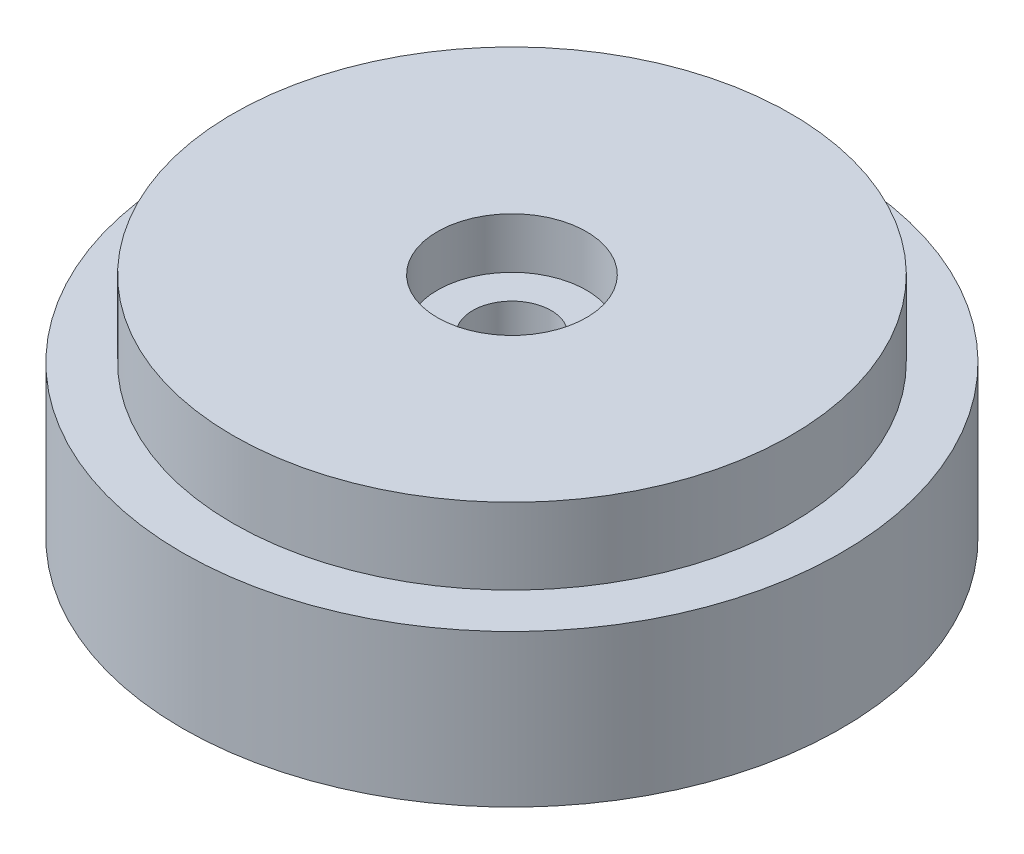
ISO-10303-21;
HEADER;
FILE_DESCRIPTION(('STEP AP214'),'2;1');
FILE_NAME('part.step','',(''),(''),'','','');
FILE_SCHEMA(('AUTOMOTIVE_DESIGN { 1 0 10303 214 1 1 1 1 }'));
ENDSEC;
DATA;
#1=APPLICATION_CONTEXT('core data for automotive mechanical design processes');
#2=APPLICATION_PROTOCOL_DEFINITION('international standard','automotive_design',2000,#1);
#3=PRODUCT_CONTEXT('',#1,'mechanical');
#4=PRODUCT('Part','Part','',(#3));
#5=PRODUCT_RELATED_PRODUCT_CATEGORY('part','',(#4));
#6=PRODUCT_DEFINITION_FORMATION('','',#4);
#7=PRODUCT_DEFINITION_CONTEXT('part definition',#1,'design');
#8=PRODUCT_DEFINITION('design','',#6,#7);
#9=PRODUCT_DEFINITION_SHAPE('','',#8);
#10=(LENGTH_UNIT() NAMED_UNIT(*) SI_UNIT(.MILLI.,.METRE.));
#11=(NAMED_UNIT(*) PLANE_ANGLE_UNIT() SI_UNIT($,.RADIAN.));
#12=(NAMED_UNIT(*) SI_UNIT($,.STERADIAN.) SOLID_ANGLE_UNIT());
#13=UNCERTAINTY_MEASURE_WITH_UNIT(LENGTH_MEASURE(1.E-05),#10,'distance_accuracy_value','');
#14=(GEOMETRIC_REPRESENTATION_CONTEXT(3) GLOBAL_UNCERTAINTY_ASSIGNED_CONTEXT((#13)) GLOBAL_UNIT_ASSIGNED_CONTEXT((#10,
#11,#12)) REPRESENTATION_CONTEXT('',''));
#15=CARTESIAN_POINT('',(0.,0.,0.));
#16=DIRECTION('',(0.,0.,1.));
#17=DIRECTION('',(1.,0.,0.));
#18=AXIS2_PLACEMENT_3D('',#15,#16,#17);
#19=CARTESIAN_POINT('',(0.,9.,0.));
#20=DIRECTION('',(0.,-1.,0.));
#21=DIRECTION('',(0.,0.,-1.));
#22=AXIS2_PLACEMENT_3D('',#19,#20,#21);
#23=CYLINDRICAL_SURFACE('',#22,2.94);
#24=CARTESIAN_POINT('',(0.,7.,0.));
#25=DIRECTION('',(0.,1.,0.));
#26=DIRECTION('',(0.,0.,1.));
#27=AXIS2_PLACEMENT_3D('',#24,#25,#26);
#28=CIRCLE('',#27,2.94);
#29=CARTESIAN_POINT('',(0.,7.,2.94));
#30=VERTEX_POINT('',#29);
#31=EDGE_CURVE('E10',#30,#30,#28,.T.);
#32=ORIENTED_EDGE('',*,*,#31,.F.);
#33=EDGE_LOOP('',(#32));
#34=FACE_BOUND('',#33,.T.);
#35=CARTESIAN_POINT('',(0.,9.,0.));
#36=DIRECTION('',(0.,1.,0.));
#37=DIRECTION('',(0.,0.,1.));
#38=AXIS2_PLACEMENT_3D('',#35,#36,#37);
#39=CIRCLE('',#38,2.94);
#40=CARTESIAN_POINT('',(0.,9.,2.94));
#41=VERTEX_POINT('',#40);
#42=EDGE_CURVE('E51',#41,#41,#39,.T.);
#43=ORIENTED_EDGE('',*,*,#42,.T.);
#44=EDGE_LOOP('',(#43));
#45=FACE_BOUND('',#44,.T.);
#46=ADVANCED_FACE('F41',(#34,#45),#23,.F.);
#47=CARTESIAN_POINT('',(0.,9.,0.));
#48=DIRECTION('',(0.,-1.,0.));
#49=DIRECTION('',(0.,0.,-1.));
#50=AXIS2_PLACEMENT_3D('',#47,#48,#49);
#51=CYLINDRICAL_SURFACE('',#50,11.);
#52=CARTESIAN_POINT('',(0.,6.,0.));
#53=DIRECTION('',(0.,1.,0.));
#54=DIRECTION('',(0.,0.,1.));
#55=AXIS2_PLACEMENT_3D('',#52,#53,#54);
#56=CIRCLE('',#55,11.);
#57=CARTESIAN_POINT('',(0.,6.,11.));
#58=VERTEX_POINT('',#57);
#59=EDGE_CURVE('E97',#58,#58,#56,.T.);
#60=ORIENTED_EDGE('',*,*,#59,.T.);
#61=EDGE_LOOP('',(#60));
#62=FACE_BOUND('',#61,.T.);
#63=CARTESIAN_POINT('',(0.,9.,0.));
#64=DIRECTION('',(0.,1.,0.));
#65=DIRECTION('',(0.,0.,1.));
#66=AXIS2_PLACEMENT_3D('',#63,#64,#65);
#67=CIRCLE('',#66,11.);
#68=CARTESIAN_POINT('',(0.,9.,11.));
#69=VERTEX_POINT('',#68);
#70=EDGE_CURVE('E47',#69,#69,#67,.T.);
#71=ORIENTED_EDGE('',*,*,#70,.F.);
#72=EDGE_LOOP('',(#71));
#73=FACE_BOUND('',#72,.T.);
#74=ADVANCED_FACE('F103',(#62,#73),#51,.T.);
#75=CARTESIAN_POINT('',(0.,9.,0.));
#76=DIRECTION('',(0.,1.,0.));
#77=DIRECTION('',(0.,0.,1.));
#78=AXIS2_PLACEMENT_3D('',#75,#76,#77);
#79=PLANE('',#78);
#80=ORIENTED_EDGE('',*,*,#42,.F.);
#81=EDGE_LOOP('',(#80));
#82=FACE_BOUND('',#81,.T.);
#83=ORIENTED_EDGE('',*,*,#70,.T.);
#84=EDGE_LOOP('',(#83));
#85=FACE_BOUND('',#84,.T.);
#86=ADVANCED_FACE('F122',(#82,#85),#79,.T.);
#87=CARTESIAN_POINT('',(0.,0.,0.));
#88=DIRECTION('',(0.,1.,0.));
#89=DIRECTION('',(0.,0.,1.));
#90=AXIS2_PLACEMENT_3D('',#87,#88,#89);
#91=PLANE('',#90);
#92=CARTESIAN_POINT('',(-5.,0.,-5.));
#93=DIRECTION('',(0.,1.,0.));
#94=DIRECTION('',(0.,0.,1.));
#95=AXIS2_PLACEMENT_3D('',#92,#93,#94);
#96=CIRCLE('',#95,3.05);
#97=CARTESIAN_POINT('',(-5.,0.,-8.05));
#98=VERTEX_POINT('',#97);
#99=EDGE_CURVE('E76',#98,#98,#96,.T.);
#100=ORIENTED_EDGE('',*,*,#99,.T.);
#101=EDGE_LOOP('',(#100));
#102=FACE_BOUND('',#101,.T.);
#103=CARTESIAN_POINT('',(-5.,0.,5.));
#104=DIRECTION('',(0.,1.,0.));
#105=DIRECTION('',(0.,0.,1.));
#106=AXIS2_PLACEMENT_3D('',#103,#104,#105);
#107=CIRCLE('',#106,3.05);
#108=CARTESIAN_POINT('',(-5.,0.,1.95));
#109=VERTEX_POINT('',#108);
#110=EDGE_CURVE('E83',#109,#109,#107,.T.);
#111=ORIENTED_EDGE('',*,*,#110,.T.);
#112=EDGE_LOOP('',(#111));
#113=FACE_BOUND('',#112,.T.);
#114=CARTESIAN_POINT('',(5.,0.,5.));
#115=DIRECTION('',(0.,1.,0.));
#116=DIRECTION('',(0.,0.,1.));
#117=AXIS2_PLACEMENT_3D('',#114,#115,#116);
#118=CIRCLE('',#117,3.05);
#119=CARTESIAN_POINT('',(5.,0.,1.95));
#120=VERTEX_POINT('',#119);
#121=EDGE_CURVE('E89',#120,#120,#118,.T.);
#122=ORIENTED_EDGE('',*,*,#121,.T.);
#123=EDGE_LOOP('',(#122));
#124=FACE_BOUND('',#123,.T.);
#125=CARTESIAN_POINT('',(5.,0.,-5.));
#126=DIRECTION('',(0.,1.,0.));
#127=DIRECTION('',(0.,0.,1.));
#128=AXIS2_PLACEMENT_3D('',#125,#126,#127);
#129=CIRCLE('',#128,3.05);
#130=CARTESIAN_POINT('',(5.,0.,-8.05));
#131=VERTEX_POINT('',#130);
#132=EDGE_CURVE('E70',#131,#131,#129,.T.);
#133=ORIENTED_EDGE('',*,*,#132,.T.);
#134=EDGE_LOOP('',(#133));
#135=FACE_BOUND('',#134,.T.);
#136=CARTESIAN_POINT('',(0.,0.,0.));
#137=DIRECTION('',(0.,1.,0.));
#138=DIRECTION('',(0.,0.,1.));
#139=AXIS2_PLACEMENT_3D('',#136,#137,#138);
#140=CIRCLE('',#139,2.94);
#141=CARTESIAN_POINT('',(0.,0.,2.94));
#142=VERTEX_POINT('',#141);
#143=EDGE_CURVE('E61',#142,#142,#140,.T.);
#144=ORIENTED_EDGE('',*,*,#143,.T.);
#145=EDGE_LOOP('',(#144));
#146=FACE_BOUND('',#145,.T.);
#147=CARTESIAN_POINT('',(0.,0.,0.));
#148=DIRECTION('',(0.,1.,0.));
#149=DIRECTION('',(0.,0.,1.));
#150=AXIS2_PLACEMENT_3D('',#147,#148,#149);
#151=CIRCLE('',#150,13.);
#152=CARTESIAN_POINT('',(0.,0.,13.));
#153=VERTEX_POINT('',#152);
#154=EDGE_CURVE('E94',#153,#153,#151,.T.);
#155=ORIENTED_EDGE('',*,*,#154,.F.);
#156=EDGE_LOOP('',(#155));
#157=FACE_BOUND('',#156,.T.);
#158=ADVANCED_FACE('F119',(#102,#113,#124,#135,#146,#157),#91,.F.);
#159=CARTESIAN_POINT('',(0.,7.,0.));
#160=DIRECTION('',(0.,-1.,0.));
#161=DIRECTION('',(0.,0.,-1.));
#162=AXIS2_PLACEMENT_3D('',#159,#160,#161);
#163=CYLINDRICAL_SURFACE('',#162,1.55);
#164=CARTESIAN_POINT('',(0.,3.,0.));
#165=DIRECTION('',(0.,1.,0.));
#166=DIRECTION('',(0.,0.,1.));
#167=AXIS2_PLACEMENT_3D('',#164,#165,#166);
#168=CIRCLE('',#167,1.55);
#169=CARTESIAN_POINT('',(0.,3.,1.55));
#170=VERTEX_POINT('',#169);
#171=EDGE_CURVE('E64',#170,#170,#168,.T.);
#172=ORIENTED_EDGE('',*,*,#171,.F.);
#173=EDGE_LOOP('',(#172));
#174=FACE_BOUND('',#173,.T.);
#175=CARTESIAN_POINT('',(0.,7.,0.));
#176=DIRECTION('',(0.,1.,0.));
#177=DIRECTION('',(0.,0.,1.));
#178=AXIS2_PLACEMENT_3D('',#175,#176,#177);
#179=CIRCLE('',#178,1.55);
#180=CARTESIAN_POINT('',(0.,7.,1.55));
#181=VERTEX_POINT('',#180);
#182=EDGE_CURVE('E55',#181,#181,#179,.T.);
#183=ORIENTED_EDGE('',*,*,#182,.T.);
#184=EDGE_LOOP('',(#183));
#185=FACE_BOUND('',#184,.T.);
#186=ADVANCED_FACE('F121',(#174,#185),#163,.F.);
#187=CARTESIAN_POINT('',(0.,7.,0.));
#188=DIRECTION('',(0.,1.,0.));
#189=DIRECTION('',(0.,0.,1.));
#190=AXIS2_PLACEMENT_3D('',#187,#188,#189);
#191=PLANE('',#190);
#192=ORIENTED_EDGE('',*,*,#182,.F.);
#193=EDGE_LOOP('',(#192));
#194=FACE_BOUND('',#193,.T.);
#195=ORIENTED_EDGE('',*,*,#31,.T.);
#196=EDGE_LOOP('',(#195));
#197=FACE_BOUND('',#196,.T.);
#198=ADVANCED_FACE('F129',(#194,#197),#191,.T.);
#199=CARTESIAN_POINT('',(0.,3.,0.));
#200=DIRECTION('',(0.,-1.,0.));
#201=DIRECTION('',(0.,0.,-1.));
#202=AXIS2_PLACEMENT_3D('',#199,#200,#201);
#203=CYLINDRICAL_SURFACE('',#202,2.94);
#204=CARTESIAN_POINT('',(0.,3.,0.));
#205=DIRECTION('',(0.,1.,0.));
#206=DIRECTION('',(0.,0.,1.));
#207=AXIS2_PLACEMENT_3D('',#204,#205,#206);
#208=CIRCLE('',#207,2.94);
#209=CARTESIAN_POINT('',(0.,3.,2.94));
#210=VERTEX_POINT('',#209);
#211=EDGE_CURVE('E60',#210,#210,#208,.T.);
#212=ORIENTED_EDGE('',*,*,#211,.T.);
#213=EDGE_LOOP('',(#212));
#214=FACE_BOUND('',#213,.T.);
#215=ORIENTED_EDGE('',*,*,#143,.F.);
#216=EDGE_LOOP('',(#215));
#217=FACE_BOUND('',#216,.T.);
#218=ADVANCED_FACE('F225',(#214,#217),#203,.F.);
#219=CARTESIAN_POINT('',(0.,3.,0.));
#220=DIRECTION('',(0.,1.,0.));
#221=DIRECTION('',(0.,0.,1.));
#222=AXIS2_PLACEMENT_3D('',#219,#220,#221);
#223=PLANE('',#222);
#224=ORIENTED_EDGE('',*,*,#171,.T.);
#225=EDGE_LOOP('',(#224));
#226=FACE_BOUND('',#225,.T.);
#227=ORIENTED_EDGE('',*,*,#211,.F.);
#228=EDGE_LOOP('',(#227));
#229=FACE_BOUND('',#228,.T.);
#230=ADVANCED_FACE('F216',(#226,#229),#223,.F.);
#231=CARTESIAN_POINT('',(5.,8.6,-5.));
#232=DIRECTION('',(0.,-1.,0.));
#233=DIRECTION('',(0.,0.,-1.));
#234=AXIS2_PLACEMENT_3D('',#231,#232,#233);
#235=CYLINDRICAL_SURFACE('',#234,3.05);
#236=CARTESIAN_POINT('',(5.,8.6,-5.));
#237=DIRECTION('',(0.,1.,0.));
#238=DIRECTION('',(0.,0.,1.));
#239=AXIS2_PLACEMENT_3D('',#236,#237,#238);
#240=CIRCLE('',#239,3.05);
#241=CARTESIAN_POINT('',(5.,8.6,-8.05));
#242=VERTEX_POINT('',#241);
#243=EDGE_CURVE('E65',#242,#242,#240,.T.);
#244=CARTESIAN_POINT('',(5.,8.6,-8.05));
#245=CARTESIAN_POINT('',(5.,8.51041666666666,-8.05));
#246=CARTESIAN_POINT('',(5.,8.42083333333333,-8.05));
#247=CARTESIAN_POINT('',(5.,8.24166666666667,-8.05));
#248=CARTESIAN_POINT('',(5.,8.15208333333333,-8.05));
#249=CARTESIAN_POINT('',(5.,7.97291666666667,-8.05));
#250=CARTESIAN_POINT('',(5.,7.88333333333333,-8.05));
#251=CARTESIAN_POINT('',(5.,7.70416666666667,-8.05));
#252=CARTESIAN_POINT('',(5.,7.61458333333333,-8.05));
#253=CARTESIAN_POINT('',(5.,7.43541666666667,-8.05));
#254=CARTESIAN_POINT('',(5.,7.34583333333333,-8.05));
#255=CARTESIAN_POINT('',(5.,7.16666666666667,-8.05));
#256=CARTESIAN_POINT('',(5.,7.07708333333333,-8.05));
#257=CARTESIAN_POINT('',(5.,6.89791666666667,-8.05));
#258=CARTESIAN_POINT('',(5.,6.80833333333333,-8.05));
#259=CARTESIAN_POINT('',(5.,6.62916666666667,-8.05));
#260=CARTESIAN_POINT('',(5.,6.53958333333333,-8.05));
#261=CARTESIAN_POINT('',(5.,6.36041666666667,-8.05));
#262=CARTESIAN_POINT('',(5.,6.27083333333333,-8.05));
#263=CARTESIAN_POINT('',(5.,6.09166666666667,-8.05));
#264=CARTESIAN_POINT('',(5.,6.00208333333333,-8.05));
#265=CARTESIAN_POINT('',(5.,5.82291666666667,-8.05));
#266=CARTESIAN_POINT('',(5.,5.73333333333333,-8.05));
#267=CARTESIAN_POINT('',(5.,5.55416666666667,-8.05));
#268=CARTESIAN_POINT('',(5.,5.46458333333333,-8.05));
#269=CARTESIAN_POINT('',(5.,5.28541666666667,-8.05));
#270=CARTESIAN_POINT('',(5.,5.19583333333333,-8.05));
#271=CARTESIAN_POINT('',(5.,5.01666666666667,-8.05));
#272=CARTESIAN_POINT('',(5.,4.92708333333333,-8.05));
#273=CARTESIAN_POINT('',(5.,4.74791666666667,-8.05));
#274=CARTESIAN_POINT('',(5.,4.65833333333333,-8.05));
#275=CARTESIAN_POINT('',(5.,4.47916666666667,-8.05));
#276=CARTESIAN_POINT('',(5.,4.38958333333333,-8.05));
#277=CARTESIAN_POINT('',(5.,4.21041666666667,-8.05));
#278=CARTESIAN_POINT('',(5.,4.12083333333333,-8.05));
#279=CARTESIAN_POINT('',(5.,3.94166666666667,-8.05));
#280=CARTESIAN_POINT('',(5.,3.85208333333333,-8.05));
#281=CARTESIAN_POINT('',(5.,3.67291666666667,-8.05));
#282=CARTESIAN_POINT('',(5.,3.58333333333333,-8.05));
#283=CARTESIAN_POINT('',(5.,3.40416666666667,-8.05));
#284=CARTESIAN_POINT('',(5.,3.31458333333333,-8.05));
#285=CARTESIAN_POINT('',(5.,3.13541666666667,-8.05));
#286=CARTESIAN_POINT('',(5.,3.04583333333333,-8.05));
#287=CARTESIAN_POINT('',(5.,2.86666666666667,-8.05));
#288=CARTESIAN_POINT('',(5.,2.77708333333333,-8.05));
#289=CARTESIAN_POINT('',(5.,2.59791666666667,-8.05));
#290=CARTESIAN_POINT('',(5.,2.50833333333333,-8.05));
#291=CARTESIAN_POINT('',(5.,2.32916666666667,-8.05));
#292=CARTESIAN_POINT('',(5.,2.23958333333333,-8.05));
#293=CARTESIAN_POINT('',(5.,2.06041666666667,-8.05));
#294=CARTESIAN_POINT('',(5.,1.97083333333333,-8.05));
#295=CARTESIAN_POINT('',(5.,1.79166666666667,-8.05));
#296=CARTESIAN_POINT('',(5.,1.70208333333333,-8.05));
#297=CARTESIAN_POINT('',(5.,1.52291666666667,-8.05));
#298=CARTESIAN_POINT('',(5.,1.43333333333333,-8.05));
#299=CARTESIAN_POINT('',(5.,1.25416666666667,-8.05));
#300=CARTESIAN_POINT('',(5.,1.16458333333333,-8.05));
#301=CARTESIAN_POINT('',(5.,0.985416666666665,-8.05));
#302=CARTESIAN_POINT('',(5.,0.895833333333332,-8.05));
#303=CARTESIAN_POINT('',(5.,0.716666666666665,-8.05));
#304=CARTESIAN_POINT('',(5.,0.627083333333332,-8.05));
#305=CARTESIAN_POINT('',(5.,0.447916666666665,-8.05));
#306=CARTESIAN_POINT('',(5.,0.358333333333331,-8.05));
#307=CARTESIAN_POINT('',(5.,0.179166666666665,-8.05));
#308=CARTESIAN_POINT('',(5.,0.0895833333333315,-8.05));
#309=CARTESIAN_POINT('',(5.,0.,-8.05));
#310=B_SPLINE_CURVE_WITH_KNOTS('',3,(#244,#245,#246,#247,#248,#249,#250,#251,#252,#253,#254,
#255,#256,#257,#258,#259,#260,#261,#262,#263,#264,#265,#266,#267,#268,#269,#270,#271,#272,#273,
#274,#275,#276,#277,#278,#279,#280,#281,#282,#283,#284,#285,#286,#287,#288,#289,#290,#291,#292,
#293,#294,#295,#296,#297,#298,#299,#300,#301,#302,#303,#304,#305,#306,#307,#308,#309),
.UNSPECIFIED.,.F.,.F.,(4,2,2,2,2,2,2,2,2,2,2,2,2,2,2,2,2,2,2,2,2,2,2,2,2,2,2,2,2,2,2,2,4),(0.,
0.26875,0.5375,0.806249999999999,1.075,1.34375,1.6125,1.88125,2.15,2.41875,2.6875,2.95625,3.225,
3.49375,3.7625,4.03125,4.3,4.56875,4.8375,5.10625,5.375,5.64375,5.9125,6.18125,6.45,6.71875,
6.9875,7.25625,7.525,7.79375,8.0625,8.33125,8.6),.UNSPECIFIED.);
#311=EDGE_CURVE('BSEAM207',#242,#131,#310,.T.);
#312=ORIENTED_EDGE('',*,*,#243,.T.);
#313=ORIENTED_EDGE('',*,*,#132,.F.);
#314=ORIENTED_EDGE('',*,*,#311,.T.);
#315=ORIENTED_EDGE('',*,*,#311,.F.);
#316=EDGE_LOOP('',(#312,#314,#313,#315));
#317=FACE_BOUND('',#316,.T.);
#318=ADVANCED_FACE('F207',(#317),#235,.F.);
#319=CARTESIAN_POINT('',(0.,8.6,0.));
#320=DIRECTION('',(0.,1.,0.));
#321=DIRECTION('',(0.,0.,1.));
#322=AXIS2_PLACEMENT_3D('',#319,#320,#321);
#323=PLANE('',#322);
#324=ORIENTED_EDGE('',*,*,#243,.F.);
#325=EDGE_LOOP('',(#324));
#326=FACE_BOUND('',#325,.T.);
#327=ADVANCED_FACE('F198',(#326),#323,.F.);
#328=CARTESIAN_POINT('',(5.,8.6,5.));
#329=DIRECTION('',(0.,-1.,0.));
#330=DIRECTION('',(0.,0.,-1.));
#331=AXIS2_PLACEMENT_3D('',#328,#329,#330);
#332=CYLINDRICAL_SURFACE('',#331,3.05);
#333=CARTESIAN_POINT('',(5.,8.6,5.));
#334=DIRECTION('',(0.,1.,0.));
#335=DIRECTION('',(0.,0.,1.));
#336=AXIS2_PLACEMENT_3D('',#333,#334,#335);
#337=CIRCLE('',#336,3.05);
#338=CARTESIAN_POINT('',(5.,8.6,1.95));
#339=VERTEX_POINT('',#338);
#340=EDGE_CURVE('E73',#339,#339,#337,.T.);
#341=CARTESIAN_POINT('',(5.,8.6,1.95));
#342=CARTESIAN_POINT('',(5.,8.51041666666666,1.95));
#343=CARTESIAN_POINT('',(5.,8.42083333333333,1.95));
#344=CARTESIAN_POINT('',(5.,8.24166666666667,1.95));
#345=CARTESIAN_POINT('',(5.,8.15208333333333,1.95));
#346=CARTESIAN_POINT('',(5.,7.97291666666667,1.95));
#347=CARTESIAN_POINT('',(5.,7.88333333333333,1.95));
#348=CARTESIAN_POINT('',(5.,7.70416666666667,1.95));
#349=CARTESIAN_POINT('',(5.,7.61458333333333,1.95));
#350=CARTESIAN_POINT('',(5.,7.43541666666667,1.95));
#351=CARTESIAN_POINT('',(5.,7.34583333333333,1.95));
#352=CARTESIAN_POINT('',(5.,7.16666666666667,1.95));
#353=CARTESIAN_POINT('',(5.,7.07708333333333,1.95));
#354=CARTESIAN_POINT('',(5.,6.89791666666667,1.95));
#355=CARTESIAN_POINT('',(5.,6.80833333333333,1.95));
#356=CARTESIAN_POINT('',(5.,6.62916666666667,1.95));
#357=CARTESIAN_POINT('',(5.,6.53958333333333,1.95));
#358=CARTESIAN_POINT('',(5.,6.36041666666667,1.95));
#359=CARTESIAN_POINT('',(5.,6.27083333333333,1.95));
#360=CARTESIAN_POINT('',(5.,6.09166666666667,1.95));
#361=CARTESIAN_POINT('',(5.,6.00208333333333,1.95));
#362=CARTESIAN_POINT('',(5.,5.82291666666667,1.95));
#363=CARTESIAN_POINT('',(5.,5.73333333333333,1.95));
#364=CARTESIAN_POINT('',(5.,5.55416666666667,1.95));
#365=CARTESIAN_POINT('',(5.,5.46458333333333,1.95));
#366=CARTESIAN_POINT('',(5.,5.28541666666667,1.95));
#367=CARTESIAN_POINT('',(5.,5.19583333333333,1.95));
#368=CARTESIAN_POINT('',(5.,5.01666666666667,1.95));
#369=CARTESIAN_POINT('',(5.,4.92708333333333,1.95));
#370=CARTESIAN_POINT('',(5.,4.74791666666667,1.95));
#371=CARTESIAN_POINT('',(5.,4.65833333333333,1.95));
#372=CARTESIAN_POINT('',(5.,4.47916666666667,1.95));
#373=CARTESIAN_POINT('',(5.,4.38958333333333,1.95));
#374=CARTESIAN_POINT('',(5.,4.21041666666667,1.95));
#375=CARTESIAN_POINT('',(5.,4.12083333333333,1.95));
#376=CARTESIAN_POINT('',(5.,3.94166666666667,1.95));
#377=CARTESIAN_POINT('',(5.,3.85208333333333,1.95));
#378=CARTESIAN_POINT('',(5.,3.67291666666667,1.95));
#379=CARTESIAN_POINT('',(5.,3.58333333333333,1.95));
#380=CARTESIAN_POINT('',(5.,3.40416666666667,1.95));
#381=CARTESIAN_POINT('',(5.,3.31458333333333,1.95));
#382=CARTESIAN_POINT('',(5.,3.13541666666667,1.95));
#383=CARTESIAN_POINT('',(5.,3.04583333333333,1.95));
#384=CARTESIAN_POINT('',(5.,2.86666666666667,1.95));
#385=CARTESIAN_POINT('',(5.,2.77708333333333,1.95));
#386=CARTESIAN_POINT('',(5.,2.59791666666667,1.95));
#387=CARTESIAN_POINT('',(5.,2.50833333333333,1.95));
#388=CARTESIAN_POINT('',(5.,2.32916666666667,1.95));
#389=CARTESIAN_POINT('',(5.,2.23958333333333,1.95));
#390=CARTESIAN_POINT('',(5.,2.06041666666667,1.95));
#391=CARTESIAN_POINT('',(5.,1.97083333333333,1.95));
#392=CARTESIAN_POINT('',(5.,1.79166666666667,1.95));
#393=CARTESIAN_POINT('',(5.,1.70208333333333,1.95));
#394=CARTESIAN_POINT('',(5.,1.52291666666667,1.95));
#395=CARTESIAN_POINT('',(5.,1.43333333333333,1.95));
#396=CARTESIAN_POINT('',(5.,1.25416666666667,1.95));
#397=CARTESIAN_POINT('',(5.,1.16458333333333,1.95));
#398=CARTESIAN_POINT('',(5.,0.985416666666665,1.95));
#399=CARTESIAN_POINT('',(5.,0.895833333333332,1.95));
#400=CARTESIAN_POINT('',(5.,0.716666666666665,1.95));
#401=CARTESIAN_POINT('',(5.,0.627083333333332,1.95));
#402=CARTESIAN_POINT('',(5.,0.447916666666665,1.95));
#403=CARTESIAN_POINT('',(5.,0.358333333333331,1.95));
#404=CARTESIAN_POINT('',(5.,0.179166666666665,1.95));
#405=CARTESIAN_POINT('',(5.,0.0895833333333315,1.95));
#406=CARTESIAN_POINT('',(5.,0.,1.95));
#407=B_SPLINE_CURVE_WITH_KNOTS('',3,(#341,#342,#343,#344,#345,#346,#347,#348,#349,#350,#351,
#352,#353,#354,#355,#356,#357,#358,#359,#360,#361,#362,#363,#364,#365,#366,#367,#368,#369,#370,
#371,#372,#373,#374,#375,#376,#377,#378,#379,#380,#381,#382,#383,#384,#385,#386,#387,#388,#389,
#390,#391,#392,#393,#394,#395,#396,#397,#398,#399,#400,#401,#402,#403,#404,#405,#406),
.UNSPECIFIED.,.F.,.F.,(4,2,2,2,2,2,2,2,2,2,2,2,2,2,2,2,2,2,2,2,2,2,2,2,2,2,2,2,2,2,2,2,4),(0.,
0.26875,0.5375,0.806249999999999,1.075,1.34375,1.6125,1.88125,2.15,2.41875,2.6875,2.95625,3.225,
3.49375,3.7625,4.03125,4.3,4.56875,4.8375,5.10625,5.375,5.64375,5.9125,6.18125,6.45,6.71875,
6.9875,7.25625,7.525,7.79375,8.0625,8.33125,8.6),.UNSPECIFIED.);
#408=EDGE_CURVE('BSEAM189',#339,#120,#407,.T.);
#409=ORIENTED_EDGE('',*,*,#340,.T.);
#410=ORIENTED_EDGE('',*,*,#121,.F.);
#411=ORIENTED_EDGE('',*,*,#408,.T.);
#412=ORIENTED_EDGE('',*,*,#408,.F.);
#413=EDGE_LOOP('',(#409,#411,#410,#412));
#414=FACE_BOUND('',#413,.T.);
#415=ADVANCED_FACE('F189',(#414),#332,.F.);
#416=CARTESIAN_POINT('',(0.,8.6,0.));
#417=DIRECTION('',(0.,1.,0.));
#418=DIRECTION('',(0.,0.,1.));
#419=AXIS2_PLACEMENT_3D('',#416,#417,#418);
#420=PLANE('',#419);
#421=ORIENTED_EDGE('',*,*,#340,.F.);
#422=EDGE_LOOP('',(#421));
#423=FACE_BOUND('',#422,.T.);
#424=ADVANCED_FACE('F180',(#423),#420,.F.);
#425=CARTESIAN_POINT('',(-5.,8.6,5.));
#426=DIRECTION('',(0.,-1.,0.));
#427=DIRECTION('',(0.,0.,-1.));
#428=AXIS2_PLACEMENT_3D('',#425,#426,#427);
#429=CYLINDRICAL_SURFACE('',#428,3.05);
#430=CARTESIAN_POINT('',(-5.,8.6,5.));
#431=DIRECTION('',(0.,1.,0.));
#432=DIRECTION('',(0.,0.,1.));
#433=AXIS2_PLACEMENT_3D('',#430,#431,#432);
#434=CIRCLE('',#433,3.05);
#435=CARTESIAN_POINT('',(-5.,8.6,1.95));
#436=VERTEX_POINT('',#435);
#437=EDGE_CURVE('E86',#436,#436,#434,.T.);
#438=CARTESIAN_POINT('',(-5.,8.6,1.95));
#439=CARTESIAN_POINT('',(-5.,8.51041666666666,1.95));
#440=CARTESIAN_POINT('',(-5.,8.42083333333333,1.95));
#441=CARTESIAN_POINT('',(-5.,8.24166666666667,1.95));
#442=CARTESIAN_POINT('',(-5.,8.15208333333333,1.95));
#443=CARTESIAN_POINT('',(-5.,7.97291666666667,1.95));
#444=CARTESIAN_POINT('',(-5.,7.88333333333333,1.95));
#445=CARTESIAN_POINT('',(-5.,7.70416666666667,1.95));
#446=CARTESIAN_POINT('',(-5.,7.61458333333333,1.95));
#447=CARTESIAN_POINT('',(-5.,7.43541666666667,1.95));
#448=CARTESIAN_POINT('',(-5.,7.34583333333333,1.95));
#449=CARTESIAN_POINT('',(-5.,7.16666666666667,1.95));
#450=CARTESIAN_POINT('',(-5.,7.07708333333333,1.95));
#451=CARTESIAN_POINT('',(-5.,6.89791666666667,1.95));
#452=CARTESIAN_POINT('',(-5.,6.80833333333333,1.95));
#453=CARTESIAN_POINT('',(-5.,6.62916666666667,1.95));
#454=CARTESIAN_POINT('',(-5.,6.53958333333333,1.95));
#455=CARTESIAN_POINT('',(-5.,6.36041666666667,1.95));
#456=CARTESIAN_POINT('',(-5.,6.27083333333333,1.95));
#457=CARTESIAN_POINT('',(-5.,6.09166666666667,1.95));
#458=CARTESIAN_POINT('',(-5.,6.00208333333333,1.95));
#459=CARTESIAN_POINT('',(-5.,5.82291666666667,1.95));
#460=CARTESIAN_POINT('',(-5.,5.73333333333333,1.95));
#461=CARTESIAN_POINT('',(-5.,5.55416666666667,1.95));
#462=CARTESIAN_POINT('',(-5.,5.46458333333333,1.95));
#463=CARTESIAN_POINT('',(-5.,5.28541666666667,1.95));
#464=CARTESIAN_POINT('',(-5.,5.19583333333333,1.95));
#465=CARTESIAN_POINT('',(-5.,5.01666666666667,1.95));
#466=CARTESIAN_POINT('',(-5.,4.92708333333333,1.95));
#467=CARTESIAN_POINT('',(-5.,4.74791666666667,1.95));
#468=CARTESIAN_POINT('',(-5.,4.65833333333333,1.95));
#469=CARTESIAN_POINT('',(-5.,4.47916666666667,1.95));
#470=CARTESIAN_POINT('',(-5.,4.38958333333333,1.95));
#471=CARTESIAN_POINT('',(-5.,4.21041666666667,1.95));
#472=CARTESIAN_POINT('',(-5.,4.12083333333333,1.95));
#473=CARTESIAN_POINT('',(-5.,3.94166666666667,1.95));
#474=CARTESIAN_POINT('',(-5.,3.85208333333333,1.95));
#475=CARTESIAN_POINT('',(-5.,3.67291666666667,1.95));
#476=CARTESIAN_POINT('',(-5.,3.58333333333333,1.95));
#477=CARTESIAN_POINT('',(-5.,3.40416666666667,1.95));
#478=CARTESIAN_POINT('',(-5.,3.31458333333333,1.95));
#479=CARTESIAN_POINT('',(-5.,3.13541666666667,1.95));
#480=CARTESIAN_POINT('',(-5.,3.04583333333333,1.95));
#481=CARTESIAN_POINT('',(-5.,2.86666666666667,1.95));
#482=CARTESIAN_POINT('',(-5.,2.77708333333333,1.95));
#483=CARTESIAN_POINT('',(-5.,2.59791666666667,1.95));
#484=CARTESIAN_POINT('',(-5.,2.50833333333333,1.95));
#485=CARTESIAN_POINT('',(-5.,2.32916666666667,1.95));
#486=CARTESIAN_POINT('',(-5.,2.23958333333333,1.95));
#487=CARTESIAN_POINT('',(-5.,2.06041666666667,1.95));
#488=CARTESIAN_POINT('',(-5.,1.97083333333333,1.95));
#489=CARTESIAN_POINT('',(-5.,1.79166666666667,1.95));
#490=CARTESIAN_POINT('',(-5.,1.70208333333333,1.95));
#491=CARTESIAN_POINT('',(-5.,1.52291666666667,1.95));
#492=CARTESIAN_POINT('',(-5.,1.43333333333333,1.95));
#493=CARTESIAN_POINT('',(-5.,1.25416666666667,1.95));
#494=CARTESIAN_POINT('',(-5.,1.16458333333333,1.95));
#495=CARTESIAN_POINT('',(-5.,0.985416666666665,1.95));
#496=CARTESIAN_POINT('',(-5.,0.895833333333332,1.95));
#497=CARTESIAN_POINT('',(-5.,0.716666666666665,1.95));
#498=CARTESIAN_POINT('',(-5.,0.627083333333332,1.95));
#499=CARTESIAN_POINT('',(-5.,0.447916666666665,1.95));
#500=CARTESIAN_POINT('',(-5.,0.358333333333331,1.95));
#501=CARTESIAN_POINT('',(-5.,0.179166666666665,1.95));
#502=CARTESIAN_POINT('',(-5.,0.0895833333333315,1.95));
#503=CARTESIAN_POINT('',(-5.,0.,1.95));
#504=B_SPLINE_CURVE_WITH_KNOTS('',3,(#438,#439,#440,#441,#442,#443,#444,#445,#446,#447,#448,
#449,#450,#451,#452,#453,#454,#455,#456,#457,#458,#459,#460,#461,#462,#463,#464,#465,#466,#467,
#468,#469,#470,#471,#472,#473,#474,#475,#476,#477,#478,#479,#480,#481,#482,#483,#484,#485,#486,
#487,#488,#489,#490,#491,#492,#493,#494,#495,#496,#497,#498,#499,#500,#501,#502,#503),
.UNSPECIFIED.,.F.,.F.,(4,2,2,2,2,2,2,2,2,2,2,2,2,2,2,2,2,2,2,2,2,2,2,2,2,2,2,2,2,2,2,2,4),(0.,
0.26875,0.5375,0.806249999999999,1.075,1.34375,1.6125,1.88125,2.15,2.41875,2.6875,2.95625,3.225,
3.49375,3.7625,4.03125,4.3,4.56875,4.8375,5.10625,5.375,5.64375,5.9125,6.18125,6.45,6.71875,
6.9875,7.25625,7.525,7.79375,8.0625,8.33125,8.6),.UNSPECIFIED.);
#505=EDGE_CURVE('BSEAM171',#436,#109,#504,.T.);
#506=ORIENTED_EDGE('',*,*,#437,.T.);
#507=ORIENTED_EDGE('',*,*,#110,.F.);
#508=ORIENTED_EDGE('',*,*,#505,.T.);
#509=ORIENTED_EDGE('',*,*,#505,.F.);
#510=EDGE_LOOP('',(#506,#508,#507,#509));
#511=FACE_BOUND('',#510,.T.);
#512=ADVANCED_FACE('F171',(#511),#429,.F.);
#513=CARTESIAN_POINT('',(0.,8.6,0.));
#514=DIRECTION('',(0.,1.,0.));
#515=DIRECTION('',(0.,0.,1.));
#516=AXIS2_PLACEMENT_3D('',#513,#514,#515);
#517=PLANE('',#516);
#518=ORIENTED_EDGE('',*,*,#437,.F.);
#519=EDGE_LOOP('',(#518));
#520=FACE_BOUND('',#519,.T.);
#521=ADVANCED_FACE('F162',(#520),#517,.F.);
#522=CARTESIAN_POINT('',(-5.,8.6,-5.));
#523=DIRECTION('',(0.,-1.,0.));
#524=DIRECTION('',(0.,0.,-1.));
#525=AXIS2_PLACEMENT_3D('',#522,#523,#524);
#526=CYLINDRICAL_SURFACE('',#525,3.05);
#527=CARTESIAN_POINT('',(-5.,8.6,-5.));
#528=DIRECTION('',(0.,1.,0.));
#529=DIRECTION('',(0.,0.,1.));
#530=AXIS2_PLACEMENT_3D('',#527,#528,#529);
#531=CIRCLE('',#530,3.05);
#532=CARTESIAN_POINT('',(-5.,8.6,-8.05));
#533=VERTEX_POINT('',#532);
#534=EDGE_CURVE('E79',#533,#533,#531,.T.);
#535=CARTESIAN_POINT('',(-5.,8.6,-8.05));
#536=CARTESIAN_POINT('',(-5.,8.51041666666666,-8.05));
#537=CARTESIAN_POINT('',(-5.,8.42083333333333,-8.05));
#538=CARTESIAN_POINT('',(-5.,8.24166666666667,-8.05));
#539=CARTESIAN_POINT('',(-5.,8.15208333333333,-8.05));
#540=CARTESIAN_POINT('',(-5.,7.97291666666667,-8.05));
#541=CARTESIAN_POINT('',(-5.,7.88333333333333,-8.05));
#542=CARTESIAN_POINT('',(-5.,7.70416666666667,-8.05));
#543=CARTESIAN_POINT('',(-5.,7.61458333333333,-8.05));
#544=CARTESIAN_POINT('',(-5.,7.43541666666667,-8.05));
#545=CARTESIAN_POINT('',(-5.,7.34583333333333,-8.05));
#546=CARTESIAN_POINT('',(-5.,7.16666666666667,-8.05));
#547=CARTESIAN_POINT('',(-5.,7.07708333333333,-8.05));
#548=CARTESIAN_POINT('',(-5.,6.89791666666667,-8.05));
#549=CARTESIAN_POINT('',(-5.,6.80833333333333,-8.05));
#550=CARTESIAN_POINT('',(-5.,6.62916666666667,-8.05));
#551=CARTESIAN_POINT('',(-5.,6.53958333333333,-8.05));
#552=CARTESIAN_POINT('',(-5.,6.36041666666667,-8.05));
#553=CARTESIAN_POINT('',(-5.,6.27083333333333,-8.05));
#554=CARTESIAN_POINT('',(-5.,6.09166666666667,-8.05));
#555=CARTESIAN_POINT('',(-5.,6.00208333333333,-8.05));
#556=CARTESIAN_POINT('',(-5.,5.82291666666667,-8.05));
#557=CARTESIAN_POINT('',(-5.,5.73333333333333,-8.05));
#558=CARTESIAN_POINT('',(-5.,5.55416666666667,-8.05));
#559=CARTESIAN_POINT('',(-5.,5.46458333333333,-8.05));
#560=CARTESIAN_POINT('',(-5.,5.28541666666667,-8.05));
#561=CARTESIAN_POINT('',(-5.,5.19583333333333,-8.05));
#562=CARTESIAN_POINT('',(-5.,5.01666666666667,-8.05));
#563=CARTESIAN_POINT('',(-5.,4.92708333333333,-8.05));
#564=CARTESIAN_POINT('',(-5.,4.74791666666667,-8.05));
#565=CARTESIAN_POINT('',(-5.,4.65833333333333,-8.05));
#566=CARTESIAN_POINT('',(-5.,4.47916666666667,-8.05));
#567=CARTESIAN_POINT('',(-5.,4.38958333333333,-8.05));
#568=CARTESIAN_POINT('',(-5.,4.21041666666667,-8.05));
#569=CARTESIAN_POINT('',(-5.,4.12083333333333,-8.05));
#570=CARTESIAN_POINT('',(-5.,3.94166666666667,-8.05));
#571=CARTESIAN_POINT('',(-5.,3.85208333333333,-8.05));
#572=CARTESIAN_POINT('',(-5.,3.67291666666667,-8.05));
#573=CARTESIAN_POINT('',(-5.,3.58333333333333,-8.05));
#574=CARTESIAN_POINT('',(-5.,3.40416666666667,-8.05));
#575=CARTESIAN_POINT('',(-5.,3.31458333333333,-8.05));
#576=CARTESIAN_POINT('',(-5.,3.13541666666667,-8.05));
#577=CARTESIAN_POINT('',(-5.,3.04583333333333,-8.05));
#578=CARTESIAN_POINT('',(-5.,2.86666666666667,-8.05));
#579=CARTESIAN_POINT('',(-5.,2.77708333333333,-8.05));
#580=CARTESIAN_POINT('',(-5.,2.59791666666667,-8.05));
#581=CARTESIAN_POINT('',(-5.,2.50833333333333,-8.05));
#582=CARTESIAN_POINT('',(-5.,2.32916666666667,-8.05));
#583=CARTESIAN_POINT('',(-5.,2.23958333333333,-8.05));
#584=CARTESIAN_POINT('',(-5.,2.06041666666667,-8.05));
#585=CARTESIAN_POINT('',(-5.,1.97083333333333,-8.05));
#586=CARTESIAN_POINT('',(-5.,1.79166666666667,-8.05));
#587=CARTESIAN_POINT('',(-5.,1.70208333333333,-8.05));
#588=CARTESIAN_POINT('',(-5.,1.52291666666667,-8.05));
#589=CARTESIAN_POINT('',(-5.,1.43333333333333,-8.05));
#590=CARTESIAN_POINT('',(-5.,1.25416666666667,-8.05));
#591=CARTESIAN_POINT('',(-5.,1.16458333333333,-8.05));
#592=CARTESIAN_POINT('',(-5.,0.985416666666665,-8.05));
#593=CARTESIAN_POINT('',(-5.,0.895833333333332,-8.05));
#594=CARTESIAN_POINT('',(-5.,0.716666666666665,-8.05));
#595=CARTESIAN_POINT('',(-5.,0.627083333333332,-8.05));
#596=CARTESIAN_POINT('',(-5.,0.447916666666665,-8.05));
#597=CARTESIAN_POINT('',(-5.,0.358333333333331,-8.05));
#598=CARTESIAN_POINT('',(-5.,0.179166666666665,-8.05));
#599=CARTESIAN_POINT('',(-5.,0.0895833333333315,-8.05));
#600=CARTESIAN_POINT('',(-5.,0.,-8.05));
#601=B_SPLINE_CURVE_WITH_KNOTS('',3,(#535,#536,#537,#538,#539,#540,#541,#542,#543,#544,#545,
#546,#547,#548,#549,#550,#551,#552,#553,#554,#555,#556,#557,#558,#559,#560,#561,#562,#563,#564,
#565,#566,#567,#568,#569,#570,#571,#572,#573,#574,#575,#576,#577,#578,#579,#580,#581,#582,#583,
#584,#585,#586,#587,#588,#589,#590,#591,#592,#593,#594,#595,#596,#597,#598,#599,#600),
.UNSPECIFIED.,.F.,.F.,(4,2,2,2,2,2,2,2,2,2,2,2,2,2,2,2,2,2,2,2,2,2,2,2,2,2,2,2,2,2,2,2,4),(0.,
0.26875,0.5375,0.806249999999999,1.075,1.34375,1.6125,1.88125,2.15,2.41875,2.6875,2.95625,3.225,
3.49375,3.7625,4.03125,4.3,4.56875,4.8375,5.10625,5.375,5.64375,5.9125,6.18125,6.45,6.71875,
6.9875,7.25625,7.525,7.79375,8.0625,8.33125,8.6),.UNSPECIFIED.);
#602=EDGE_CURVE('BSEAM153',#533,#98,#601,.T.);
#603=ORIENTED_EDGE('',*,*,#534,.T.);
#604=ORIENTED_EDGE('',*,*,#99,.F.);
#605=ORIENTED_EDGE('',*,*,#602,.T.);
#606=ORIENTED_EDGE('',*,*,#602,.F.);
#607=EDGE_LOOP('',(#603,#605,#604,#606));
#608=FACE_BOUND('',#607,.T.);
#609=ADVANCED_FACE('F153',(#608),#526,.F.);
#610=CARTESIAN_POINT('',(0.,8.6,0.));
#611=DIRECTION('',(0.,1.,0.));
#612=DIRECTION('',(0.,0.,1.));
#613=AXIS2_PLACEMENT_3D('',#610,#611,#612);
#614=PLANE('',#613);
#615=ORIENTED_EDGE('',*,*,#534,.F.);
#616=EDGE_LOOP('',(#615));
#617=FACE_BOUND('',#616,.T.);
#618=ADVANCED_FACE('F115',(#617),#614,.F.);
#619=CARTESIAN_POINT('',(0.,6.,0.));
#620=DIRECTION('',(0.,-1.,0.));
#621=DIRECTION('',(0.,0.,-1.));
#622=AXIS2_PLACEMENT_3D('',#619,#620,#621);
#623=CYLINDRICAL_SURFACE('',#622,13.);
#624=CARTESIAN_POINT('',(0.,6.,0.));
#625=DIRECTION('',(0.,1.,0.));
#626=DIRECTION('',(0.,0.,1.));
#627=AXIS2_PLACEMENT_3D('',#624,#625,#626);
#628=CIRCLE('',#627,13.);
#629=CARTESIAN_POINT('',(0.,6.,13.));
#630=VERTEX_POINT('',#629);
#631=EDGE_CURVE('E80',#630,#630,#628,.T.);
#632=ORIENTED_EDGE('',*,*,#631,.F.);
#633=EDGE_LOOP('',(#632));
#634=FACE_BOUND('',#633,.T.);
#635=ORIENTED_EDGE('',*,*,#154,.T.);
#636=EDGE_LOOP('',(#635));
#637=FACE_BOUND('',#636,.T.);
#638=ADVANCED_FACE('F109',(#634,#637),#623,.T.);
#639=CARTESIAN_POINT('',(0.,6.,0.));
#640=DIRECTION('',(0.,1.,0.));
#641=DIRECTION('',(0.,0.,1.));
#642=AXIS2_PLACEMENT_3D('',#639,#640,#641);
#643=PLANE('',#642);
#644=ORIENTED_EDGE('',*,*,#59,.F.);
#645=EDGE_LOOP('',(#644));
#646=FACE_BOUND('',#645,.T.);
#647=ORIENTED_EDGE('',*,*,#631,.T.);
#648=EDGE_LOOP('',(#647));
#649=FACE_BOUND('',#648,.T.);
#650=ADVANCED_FACE('F106',(#646,#649),#643,.T.);
#651=CLOSED_SHELL('',(#46,#74,#86,#158,#186,#198,#218,#230,#318,#327,#415,#424,#512,#521,#609,
#618,#638,#650));
#652=MANIFOLD_SOLID_BREP('B2',#651);
#653=ADVANCED_BREP_SHAPE_REPRESENTATION('',(#18,#652),#14);
#654=SHAPE_DEFINITION_REPRESENTATION(#9,#653);
ENDSEC;
END-ISO-10303-21;
